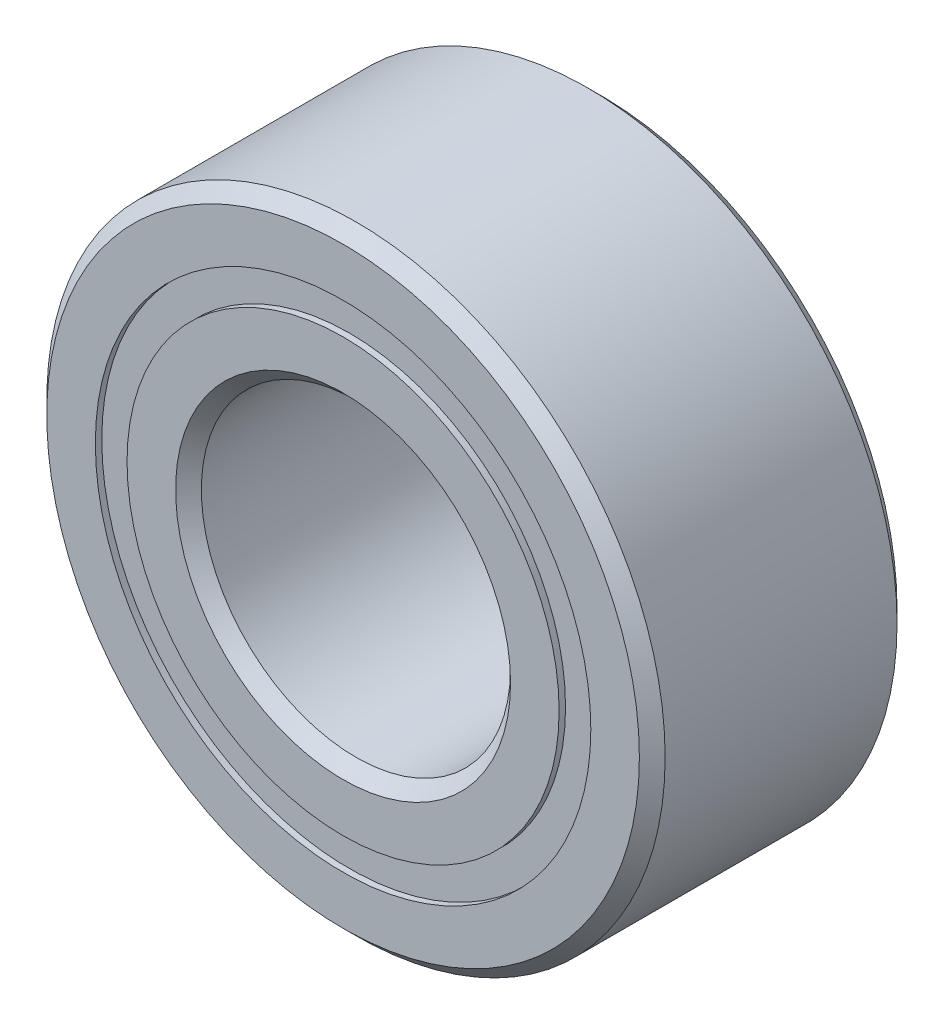
ISO-10303-21;
HEADER;
FILE_DESCRIPTION(('STEP AP214'),'2;1');
FILE_NAME('part.step','',(''),(''),'','','');
FILE_SCHEMA(('AUTOMOTIVE_DESIGN { 1 0 10303 214 1 1 1 1 }'));
ENDSEC;
DATA;
#1=APPLICATION_CONTEXT('core data for automotive mechanical design processes');
#2=APPLICATION_PROTOCOL_DEFINITION('international standard','automotive_design',2000,#1);
#3=PRODUCT_CONTEXT('',#1,'mechanical');
#4=PRODUCT('Part','Part','',(#3));
#5=PRODUCT_RELATED_PRODUCT_CATEGORY('part','',(#4));
#6=PRODUCT_DEFINITION_FORMATION('','',#4);
#7=PRODUCT_DEFINITION_CONTEXT('part definition',#1,'design');
#8=PRODUCT_DEFINITION('design','',#6,#7);
#9=PRODUCT_DEFINITION_SHAPE('','',#8);
#10=(LENGTH_UNIT() NAMED_UNIT(*) SI_UNIT(.MILLI.,.METRE.));
#11=(NAMED_UNIT(*) PLANE_ANGLE_UNIT() SI_UNIT($,.RADIAN.));
#12=(NAMED_UNIT(*) SI_UNIT($,.STERADIAN.) SOLID_ANGLE_UNIT());
#13=UNCERTAINTY_MEASURE_WITH_UNIT(LENGTH_MEASURE(1.E-05),#10,'distance_accuracy_value','');
#14=(GEOMETRIC_REPRESENTATION_CONTEXT(3) GLOBAL_UNCERTAINTY_ASSIGNED_CONTEXT((#13)) GLOBAL_UNIT_ASSIGNED_CONTEXT((#10,
#11,#12)) REPRESENTATION_CONTEXT('',''));
#15=CARTESIAN_POINT('',(0.,0.,0.));
#16=DIRECTION('',(0.,0.,1.));
#17=DIRECTION('',(1.,0.,0.));
#18=AXIS2_PLACEMENT_3D('',#15,#16,#17);
#19=CARTESIAN_POINT('',(0.,2.40384615384615,-1.1875));
#20=DIRECTION('',(0.,0.,1.));
#21=DIRECTION('',(1.,0.,0.));
#22=AXIS2_PLACEMENT_3D('',#19,#20,#21);
#23=PLANE('',#22);
#24=CARTESIAN_POINT('',(0.,0.,-1.1875));
#25=DIRECTION('',(0.,0.,1.));
#26=DIRECTION('',(1.,0.,0.));
#27=AXIS2_PLACEMENT_3D('',#24,#25,#26);
#28=CIRCLE('',#27,2.40384615384615);
#29=CARTESIAN_POINT('',(2.40384615384615,0.,-1.1875));
#30=VERTEX_POINT('',#29);
#31=EDGE_CURVE('E64',#30,#30,#28,.T.);
#32=ORIENTED_EDGE('',*,*,#31,.F.);
#33=EDGE_LOOP('',(#32));
#34=FACE_BOUND('',#33,.T.);
#35=CARTESIAN_POINT('',(0.,0.,-1.1875));
#36=DIRECTION('',(0.,0.,1.));
#37=DIRECTION('',(1.,0.,0.));
#38=AXIS2_PLACEMENT_3D('',#35,#36,#37);
#39=CIRCLE('',#38,2.09615384615385);
#40=CARTESIAN_POINT('',(2.09615384615385,0.,-1.1875));
#41=VERTEX_POINT('',#40);
#42=EDGE_CURVE('E11',#41,#41,#39,.T.);
#43=ORIENTED_EDGE('',*,*,#42,.T.);
#44=EDGE_LOOP('',(#43));
#45=FACE_BOUND('',#44,.T.);
#46=ADVANCED_FACE('F50',(#34,#45),#23,.F.);
#47=CARTESIAN_POINT('',(0.,0.,1.25));
#48=DIRECTION('',(0.,0.,1.));
#49=DIRECTION('',(1.,0.,0.));
#50=AXIS2_PLACEMENT_3D('',#47,#48,#49);
#51=CYLINDRICAL_SURFACE('',#50,2.09615384615385);
#52=ORIENTED_EDGE('',*,*,#42,.F.);
#53=EDGE_LOOP('',(#52));
#54=FACE_BOUND('',#53,.T.);
#55=CARTESIAN_POINT('',(0.,0.,-0.576463888168111));
#56=DIRECTION('',(0.,0.,1.));
#57=DIRECTION('',(1.,0.,0.));
#58=AXIS2_PLACEMENT_3D('',#55,#56,#57);
#59=CIRCLE('',#58,2.09615384615385);
#60=CARTESIAN_POINT('',(2.09615384615385,0.,-0.576463888168111));
#61=VERTEX_POINT('',#60);
#62=EDGE_CURVE('E56',#61,#61,#59,.T.);
#63=ORIENTED_EDGE('',*,*,#62,.T.);
#64=EDGE_LOOP('',(#63));
#65=FACE_BOUND('',#64,.T.);
#66=ADVANCED_FACE('F73',(#54,#65),#51,.F.);
#67=CARTESIAN_POINT('',(0.,2.40384615384615,-0.576463888168111));
#68=DIRECTION('',(0.,0.,-1.));
#69=DIRECTION('',(-1.,0.,0.));
#70=AXIS2_PLACEMENT_3D('',#67,#68,#69);
#71=PLANE('',#70);
#72=ORIENTED_EDGE('',*,*,#62,.F.);
#73=EDGE_LOOP('',(#72));
#74=FACE_BOUND('',#73,.T.);
#75=CARTESIAN_POINT('',(0.,0.,-0.576463888168111));
#76=DIRECTION('',(0.,0.,1.));
#77=DIRECTION('',(1.,0.,0.));
#78=AXIS2_PLACEMENT_3D('',#75,#76,#77);
#79=CIRCLE('',#78,2.40384615384615);
#80=CARTESIAN_POINT('',(2.40384615384615,0.,-0.576463888168111));
#81=VERTEX_POINT('',#80);
#82=EDGE_CURVE('E60',#81,#81,#79,.T.);
#83=ORIENTED_EDGE('',*,*,#82,.T.);
#84=EDGE_LOOP('',(#83));
#85=FACE_BOUND('',#84,.T.);
#86=ADVANCED_FACE('F77',(#74,#85),#71,.F.);
#87=CARTESIAN_POINT('',(0.,0.,1.25));
#88=DIRECTION('',(0.,0.,1.));
#89=DIRECTION('',(1.,0.,0.));
#90=AXIS2_PLACEMENT_3D('',#87,#88,#89);
#91=CYLINDRICAL_SURFACE('',#90,2.40384615384615);
#92=ORIENTED_EDGE('',*,*,#82,.F.);
#93=EDGE_LOOP('',(#92));
#94=FACE_BOUND('',#93,.T.);
#95=ORIENTED_EDGE('',*,*,#31,.T.);
#96=EDGE_LOOP('',(#95));
#97=FACE_BOUND('',#96,.T.);
#98=ADVANCED_FACE('F70',(#94,#97),#91,.T.);
#99=CLOSED_SHELL('',(#46,#66,#86,#98));
#100=MANIFOLD_SOLID_BREP('B2',#99);
#101=CARTESIAN_POINT('',(0.,2.40384615384615,1.1875));
#102=DIRECTION('',(0.,0.,-1.));
#103=DIRECTION('',(-1.,0.,0.));
#104=AXIS2_PLACEMENT_3D('',#101,#102,#103);
#105=PLANE('',#104);
#106=CARTESIAN_POINT('',(0.,0.,1.1875));
#107=DIRECTION('',(0.,0.,1.));
#108=DIRECTION('',(1.,0.,0.));
#109=AXIS2_PLACEMENT_3D('',#106,#107,#108);
#110=CIRCLE('',#109,2.09615384615385);
#111=CARTESIAN_POINT('',(2.09615384615385,0.,1.1875));
#112=VERTEX_POINT('',#111);
#113=EDGE_CURVE('E49',#112,#112,#110,.T.);
#114=ORIENTED_EDGE('',*,*,#113,.F.);
#115=EDGE_LOOP('',(#114));
#116=FACE_BOUND('',#115,.T.);
#117=CARTESIAN_POINT('',(0.,0.,1.1875));
#118=DIRECTION('',(0.,0.,1.));
#119=DIRECTION('',(1.,0.,0.));
#120=AXIS2_PLACEMENT_3D('',#117,#118,#119);
#121=CIRCLE('',#120,2.40384615384615);
#122=CARTESIAN_POINT('',(2.40384615384615,0.,1.1875));
#123=VERTEX_POINT('',#122);
#124=EDGE_CURVE('E124',#123,#123,#121,.T.);
#125=ORIENTED_EDGE('',*,*,#124,.T.);
#126=EDGE_LOOP('',(#125));
#127=FACE_BOUND('',#126,.T.);
#128=ADVANCED_FACE('F110',(#116,#127),#105,.F.);
#129=CARTESIAN_POINT('',(0.,0.,1.25));
#130=DIRECTION('',(0.,0.,1.));
#131=DIRECTION('',(1.,0.,0.));
#132=AXIS2_PLACEMENT_3D('',#129,#130,#131);
#133=CYLINDRICAL_SURFACE('',#132,2.09615384615385);
#134=CARTESIAN_POINT('',(0.,0.,0.576463888168111));
#135=DIRECTION('',(0.,0.,1.));
#136=DIRECTION('',(1.,0.,0.));
#137=AXIS2_PLACEMENT_3D('',#134,#135,#136);
#138=CIRCLE('',#137,2.09615384615385);
#139=CARTESIAN_POINT('',(2.09615384615385,0.,0.576463888168111));
#140=VERTEX_POINT('',#139);
#141=EDGE_CURVE('E116',#140,#140,#138,.T.);
#142=ORIENTED_EDGE('',*,*,#141,.F.);
#143=EDGE_LOOP('',(#142));
#144=FACE_BOUND('',#143,.T.);
#145=ORIENTED_EDGE('',*,*,#113,.T.);
#146=EDGE_LOOP('',(#145));
#147=FACE_BOUND('',#146,.T.);
#148=ADVANCED_FACE('F139',(#144,#147),#133,.F.);
#149=CARTESIAN_POINT('',(0.,2.40384615384615,0.576463888168111));
#150=DIRECTION('',(0.,0.,1.));
#151=DIRECTION('',(1.,0.,0.));
#152=AXIS2_PLACEMENT_3D('',#149,#150,#151);
#153=PLANE('',#152);
#154=CARTESIAN_POINT('',(0.,0.,0.576463888168111));
#155=DIRECTION('',(0.,0.,1.));
#156=DIRECTION('',(1.,0.,0.));
#157=AXIS2_PLACEMENT_3D('',#154,#155,#156);
#158=CIRCLE('',#157,2.40384615384615);
#159=CARTESIAN_POINT('',(2.40384615384615,0.,0.576463888168111));
#160=VERTEX_POINT('',#159);
#161=EDGE_CURVE('E120',#160,#160,#158,.T.);
#162=ORIENTED_EDGE('',*,*,#161,.F.);
#163=EDGE_LOOP('',(#162));
#164=FACE_BOUND('',#163,.T.);
#165=ORIENTED_EDGE('',*,*,#141,.T.);
#166=EDGE_LOOP('',(#165));
#167=FACE_BOUND('',#166,.T.);
#168=ADVANCED_FACE('F134',(#164,#167),#153,.F.);
#169=CARTESIAN_POINT('',(0.,0.,1.25));
#170=DIRECTION('',(0.,0.,1.));
#171=DIRECTION('',(1.,0.,0.));
#172=AXIS2_PLACEMENT_3D('',#169,#170,#171);
#173=CYLINDRICAL_SURFACE('',#172,2.40384615384615);
#174=ORIENTED_EDGE('',*,*,#124,.F.);
#175=EDGE_LOOP('',(#174));
#176=FACE_BOUND('',#175,.T.);
#177=ORIENTED_EDGE('',*,*,#161,.T.);
#178=EDGE_LOOP('',(#177));
#179=FACE_BOUND('',#178,.T.);
#180=ADVANCED_FACE('F131',(#176,#179),#173,.T.);
#181=CLOSED_SHELL('',(#128,#148,#168,#180));
#182=MANIFOLD_SOLID_BREP('B6',#181);
#183=CARTESIAN_POINT('',(-1.12499999999998,1.948557158515,0.));
#184=DIRECTION('',(0.,0.,1.));
#185=DIRECTION('',(-0.499999999999989,0.866025403784445,0.));
#186=AXIS2_PLACEMENT_3D('',#183,#184,#185);
#187=SPHERICAL_SURFACE('',#186,0.576463888168111);
#188=CARTESIAN_POINT('',(-1.12499999999998,1.948557158515,0.576463888168111));
#189=VERTEX_POINT('',#188);
#190=VERTEX_LOOP('',#189);
#191=FACE_BOUND('',#190,.T.);
#192=ADVANCED_FACE('F170',(#191),#187,.T.);
#193=CLOSED_SHELL('',(#192));
#194=MANIFOLD_SOLID_BREP('B44',#193);
#195=CARTESIAN_POINT('',(-1.94855715851497,1.12500000000002,0.));
#196=DIRECTION('',(0.,0.,1.));
#197=DIRECTION('',(-0.866025403784433,0.50000000000001,0.));
#198=AXIS2_PLACEMENT_3D('',#195,#196,#197);
#199=SPHERICAL_SURFACE('',#198,0.576463888168111);
#200=CARTESIAN_POINT('',(-1.94855715851497,1.12500000000002,0.576463888168111));
#201=VERTEX_POINT('',#200);
#202=VERTEX_LOOP('',#201);
#203=FACE_BOUND('',#202,.T.);
#204=ADVANCED_FACE('F193',(#203),#199,.T.);
#205=CLOSED_SHELL('',(#204));
#206=MANIFOLD_SOLID_BREP('B106',#205);
#207=CARTESIAN_POINT('',(-2.25,0.,0.));
#208=DIRECTION('',(0.,0.,1.));
#209=DIRECTION('',(-1.,0.,0.));
#210=AXIS2_PLACEMENT_3D('',#207,#208,#209);
#211=SPHERICAL_SURFACE('',#210,0.576463888168111);
#212=CARTESIAN_POINT('',(-2.25,0.,0.576463888168111));
#213=VERTEX_POINT('',#212);
#214=VERTEX_LOOP('',#213);
#215=FACE_BOUND('',#214,.T.);
#216=ADVANCED_FACE('F216',(#215),#211,.T.);
#217=CLOSED_SHELL('',(#216));
#218=MANIFOLD_SOLID_BREP('B166',#217);
#219=CARTESIAN_POINT('',(-1.948557158515,-1.12499999999998,0.));
#220=DIRECTION('',(0.,0.,1.));
#221=DIRECTION('',(-0.866025403784443,-0.499999999999992,0.));
#222=AXIS2_PLACEMENT_3D('',#219,#220,#221);
#223=SPHERICAL_SURFACE('',#222,0.576463888168111);
#224=CARTESIAN_POINT('',(-1.948557158515,-1.12499999999998,0.576463888168111));
#225=VERTEX_POINT('',#224);
#226=VERTEX_LOOP('',#225);
#227=FACE_BOUND('',#226,.T.);
#228=ADVANCED_FACE('F239',(#227),#223,.T.);
#229=CLOSED_SHELL('',(#228));
#230=MANIFOLD_SOLID_BREP('B189',#229);
#231=CARTESIAN_POINT('',(-1.12500000000002,-1.94855715851498,0.));
#232=DIRECTION('',(0.,0.,1.));
#233=DIRECTION('',(-0.500000000000007,-0.866025403784435,0.));
#234=AXIS2_PLACEMENT_3D('',#231,#232,#233);
#235=SPHERICAL_SURFACE('',#234,0.576463888168111);
#236=CARTESIAN_POINT('',(-1.12500000000002,-1.94855715851498,0.576463888168111));
#237=VERTEX_POINT('',#236);
#238=VERTEX_LOOP('',#237);
#239=FACE_BOUND('',#238,.T.);
#240=ADVANCED_FACE('F262',(#239),#235,.T.);
#241=CLOSED_SHELL('',(#240));
#242=MANIFOLD_SOLID_BREP('B212',#241);
#243=CARTESIAN_POINT('',(0.,-2.25,0.));
#244=DIRECTION('',(0.,0.,1.));
#245=DIRECTION('',(0.,-1.,0.));
#246=AXIS2_PLACEMENT_3D('',#243,#244,#245);
#247=SPHERICAL_SURFACE('',#246,0.576463888168111);
#248=CARTESIAN_POINT('',(0.,-2.25,0.576463888168111));
#249=VERTEX_POINT('',#248);
#250=VERTEX_LOOP('',#249);
#251=FACE_BOUND('',#250,.T.);
#252=ADVANCED_FACE('F285',(#251),#247,.T.);
#253=CLOSED_SHELL('',(#252));
#254=MANIFOLD_SOLID_BREP('B235',#253);
#255=CARTESIAN_POINT('',(1.12499999999999,-1.94855715851499,0.));
#256=DIRECTION('',(0.,0.,1.));
#257=DIRECTION('',(0.499999999999995,-0.866025403784442,0.));
#258=AXIS2_PLACEMENT_3D('',#255,#256,#257);
#259=SPHERICAL_SURFACE('',#258,0.576463888168111);
#260=CARTESIAN_POINT('',(1.12499999999999,-1.94855715851499,0.576463888168111));
#261=VERTEX_POINT('',#260);
#262=VERTEX_LOOP('',#261);
#263=FACE_BOUND('',#262,.T.);
#264=ADVANCED_FACE('F308',(#263),#259,.T.);
#265=CLOSED_SHELL('',(#264));
#266=MANIFOLD_SOLID_BREP('B258',#265);
#267=CARTESIAN_POINT('',(1.94855715851498,-1.12500000000001,0.));
#268=DIRECTION('',(0.,0.,1.));
#269=DIRECTION('',(0.866025403784436,-0.500000000000004,0.));
#270=AXIS2_PLACEMENT_3D('',#267,#268,#269);
#271=SPHERICAL_SURFACE('',#270,0.576463888168111);
#272=CARTESIAN_POINT('',(1.94855715851498,-1.12500000000001,0.576463888168111));
#273=VERTEX_POINT('',#272);
#274=VERTEX_LOOP('',#273);
#275=FACE_BOUND('',#274,.T.);
#276=ADVANCED_FACE('F331',(#275),#271,.T.);
#277=CLOSED_SHELL('',(#276));
#278=MANIFOLD_SOLID_BREP('B281',#277);
#279=CARTESIAN_POINT('',(2.25,0.,0.));
#280=DIRECTION('',(0.,0.,1.));
#281=DIRECTION('',(1.,0.,0.));
#282=AXIS2_PLACEMENT_3D('',#279,#280,#281);
#283=SPHERICAL_SURFACE('',#282,0.576463888168111);
#284=CARTESIAN_POINT('',(2.25,0.,0.576463888168111));
#285=VERTEX_POINT('',#284);
#286=VERTEX_LOOP('',#285);
#287=FACE_BOUND('',#286,.T.);
#288=ADVANCED_FACE('F354',(#287),#283,.T.);
#289=CLOSED_SHELL('',(#288));
#290=MANIFOLD_SOLID_BREP('B304',#289);
#291=CARTESIAN_POINT('',(1.94855715851499,1.125,0.));
#292=DIRECTION('',(0.,0.,1.));
#293=DIRECTION('',(0.86602540378444,0.499999999999998,0.));
#294=AXIS2_PLACEMENT_3D('',#291,#292,#293);
#295=SPHERICAL_SURFACE('',#294,0.576463888168111);
#296=CARTESIAN_POINT('',(1.94855715851499,1.125,0.576463888168111));
#297=VERTEX_POINT('',#296);
#298=VERTEX_LOOP('',#297);
#299=FACE_BOUND('',#298,.T.);
#300=ADVANCED_FACE('F377',(#299),#295,.T.);
#301=CLOSED_SHELL('',(#300));
#302=MANIFOLD_SOLID_BREP('B327',#301);
#303=CARTESIAN_POINT('',(1.125,1.94855715851499,0.));
#304=DIRECTION('',(0.,0.,1.));
#305=DIRECTION('',(0.500000000000001,0.866025403784438,0.));
#306=AXIS2_PLACEMENT_3D('',#303,#304,#305);
#307=SPHERICAL_SURFACE('',#306,0.576463888168111);
#308=CARTESIAN_POINT('',(1.125,1.94855715851499,0.576463888168111));
#309=VERTEX_POINT('',#308);
#310=VERTEX_LOOP('',#309);
#311=FACE_BOUND('',#310,.T.);
#312=ADVANCED_FACE('F400',(#311),#307,.T.);
#313=CLOSED_SHELL('',(#312));
#314=MANIFOLD_SOLID_BREP('B350',#313);
#315=CARTESIAN_POINT('',(0.,2.25,0.));
#316=DIRECTION('',(0.,0.,1.));
#317=DIRECTION('',(0.,1.,0.));
#318=AXIS2_PLACEMENT_3D('',#315,#316,#317);
#319=SPHERICAL_SURFACE('',#318,0.576463888168111);
#320=CARTESIAN_POINT('',(0.,2.25,0.576463888168111));
#321=VERTEX_POINT('',#320);
#322=VERTEX_LOOP('',#321);
#323=FACE_BOUND('',#322,.T.);
#324=ADVANCED_FACE('F425',(#323),#319,.T.);
#325=CLOSED_SHELL('',(#324));
#326=MANIFOLD_SOLID_BREP('B373',#325);
#327=CARTESIAN_POINT('',(0.,2.09615384615385,1.25));
#328=DIRECTION('',(0.,0.,-1.));
#329=DIRECTION('',(-1.,0.,0.));
#330=AXIS2_PLACEMENT_3D('',#327,#328,#329);
#331=PLANE('',#330);
#332=CARTESIAN_POINT('',(0.,0.,1.25));
#333=DIRECTION('',(0.,0.,1.));
#334=DIRECTION('',(1.,0.,0.));
#335=AXIS2_PLACEMENT_3D('',#332,#333,#334);
#336=CIRCLE('',#335,1.625);
#337=CARTESIAN_POINT('',(1.625,0.,1.25));
#338=VERTEX_POINT('',#337);
#339=EDGE_CURVE('E471',#338,#338,#336,.T.);
#340=ORIENTED_EDGE('',*,*,#339,.F.);
#341=EDGE_LOOP('',(#340));
#342=FACE_BOUND('',#341,.T.);
#343=CARTESIAN_POINT('',(0.,0.,1.25));
#344=DIRECTION('',(0.,0.,1.));
#345=DIRECTION('',(1.,0.,0.));
#346=AXIS2_PLACEMENT_3D('',#343,#344,#345);
#347=CIRCLE('',#346,2.09615384615385);
#348=CARTESIAN_POINT('',(2.09615384615385,0.,1.25));
#349=VERTEX_POINT('',#348);
#350=EDGE_CURVE('E424',#349,#349,#347,.T.);
#351=ORIENTED_EDGE('',*,*,#350,.T.);
#352=EDGE_LOOP('',(#351));
#353=FACE_BOUND('',#352,.T.);
#354=ADVANCED_FACE('F443',(#342,#353),#331,.F.);
#355=CARTESIAN_POINT('',(0.,0.,1.25));
#356=DIRECTION('',(0.,0.,1.));
#357=DIRECTION('',(1.,0.,0.));
#358=AXIS2_PLACEMENT_3D('',#355,#356,#357);
#359=CYLINDRICAL_SURFACE('',#358,2.09615384615385);
#360=ORIENTED_EDGE('',*,*,#350,.F.);
#361=EDGE_LOOP('',(#360));
#362=FACE_BOUND('',#361,.T.);
#363=CARTESIAN_POINT('',(0.,0.,0.555555555555555));
#364=DIRECTION('',(0.,0.,1.));
#365=DIRECTION('',(1.,0.,0.));
#366=AXIS2_PLACEMENT_3D('',#363,#364,#365);
#367=CIRCLE('',#366,2.09615384615385);
#368=CARTESIAN_POINT('',(2.09615384615385,0.,0.555555555555555));
#369=VERTEX_POINT('',#368);
#370=EDGE_CURVE('E449',#369,#369,#367,.T.);
#371=ORIENTED_EDGE('',*,*,#370,.T.);
#372=EDGE_LOOP('',(#371));
#373=FACE_BOUND('',#372,.T.);
#374=ADVANCED_FACE('F478',(#362,#373),#359,.T.);
#375=CARTESIAN_POINT('',(0.,0.,0.));
#376=DIRECTION('',(0.,0.,1.));
#377=DIRECTION('',(1.,0.,0.));
#378=AXIS2_PLACEMENT_3D('',#375,#376,#377);
#379=TOROIDAL_SURFACE('',#378,2.25,0.57646388816811);
#380=ORIENTED_EDGE('',*,*,#370,.F.);
#381=EDGE_LOOP('',(#380));
#382=FACE_BOUND('',#381,.T.);
#383=CARTESIAN_POINT('',(0.,0.,-0.555555555555556));
#384=DIRECTION('',(0.,0.,1.));
#385=DIRECTION('',(1.,0.,0.));
#386=AXIS2_PLACEMENT_3D('',#383,#384,#385);
#387=CIRCLE('',#386,2.09615384615385);
#388=CARTESIAN_POINT('',(2.09615384615385,0.,-0.555555555555556));
#389=VERTEX_POINT('',#388);
#390=EDGE_CURVE('E453',#389,#389,#387,.T.);
#391=ORIENTED_EDGE('',*,*,#390,.T.);
#392=EDGE_LOOP('',(#391));
#393=FACE_BOUND('',#392,.T.);
#394=ADVANCED_FACE('F482',(#382,#393),#379,.F.);
#395=CARTESIAN_POINT('',(0.,0.,1.25));
#396=DIRECTION('',(0.,0.,1.));
#397=DIRECTION('',(1.,0.,0.));
#398=AXIS2_PLACEMENT_3D('',#395,#396,#397);
#399=CYLINDRICAL_SURFACE('',#398,2.09615384615385);
#400=ORIENTED_EDGE('',*,*,#390,.F.);
#401=EDGE_LOOP('',(#400));
#402=FACE_BOUND('',#401,.T.);
#403=CARTESIAN_POINT('',(0.,0.,-1.25));
#404=DIRECTION('',(0.,0.,1.));
#405=DIRECTION('',(1.,0.,0.));
#406=AXIS2_PLACEMENT_3D('',#403,#404,#405);
#407=CIRCLE('',#406,2.09615384615385);
#408=CARTESIAN_POINT('',(2.09615384615385,0.,-1.25));
#409=VERTEX_POINT('',#408);
#410=EDGE_CURVE('E457',#409,#409,#407,.T.);
#411=ORIENTED_EDGE('',*,*,#410,.T.);
#412=EDGE_LOOP('',(#411));
#413=FACE_BOUND('',#412,.T.);
#414=ADVANCED_FACE('F487',(#402,#413),#399,.T.);
#415=CARTESIAN_POINT('',(0.,1.625,-1.25));
#416=DIRECTION('',(0.,0.,1.));
#417=DIRECTION('',(1.,0.,0.));
#418=AXIS2_PLACEMENT_3D('',#415,#416,#417);
#419=PLANE('',#418);
#420=ORIENTED_EDGE('',*,*,#410,.F.);
#421=EDGE_LOOP('',(#420));
#422=FACE_BOUND('',#421,.T.);
#423=CARTESIAN_POINT('',(0.,0.,-1.25));
#424=DIRECTION('',(0.,0.,1.));
#425=DIRECTION('',(1.,0.,0.));
#426=AXIS2_PLACEMENT_3D('',#423,#424,#425);
#427=CIRCLE('',#426,1.625);
#428=CARTESIAN_POINT('',(1.625,0.,-1.25));
#429=VERTEX_POINT('',#428);
#430=EDGE_CURVE('E462',#429,#429,#427,.T.);
#431=ORIENTED_EDGE('',*,*,#430,.T.);
#432=EDGE_LOOP('',(#431));
#433=FACE_BOUND('',#432,.T.);
#434=ADVANCED_FACE('F493',(#422,#433),#419,.F.);
#435=CARTESIAN_POINT('',(0.,0.,-1.125));
#436=DIRECTION('',(0.,0.,-1.));
#437=DIRECTION('',(-1.,0.,0.));
#438=AXIS2_PLACEMENT_3D('',#435,#436,#437);
#439=CONICAL_SURFACE('',#438,1.5,0.785398163397449);
#440=ORIENTED_EDGE('',*,*,#430,.F.);
#441=EDGE_LOOP('',(#440));
#442=FACE_BOUND('',#441,.T.);
#443=CARTESIAN_POINT('',(0.,0.,-1.125));
#444=DIRECTION('',(0.,0.,1.));
#445=DIRECTION('',(1.,0.,0.));
#446=AXIS2_PLACEMENT_3D('',#443,#444,#445);
#447=CIRCLE('',#446,1.5);
#448=CARTESIAN_POINT('',(1.5,0.,-1.125));
#449=VERTEX_POINT('',#448);
#450=EDGE_CURVE('E465',#449,#449,#447,.T.);
#451=ORIENTED_EDGE('',*,*,#450,.T.);
#452=EDGE_LOOP('',(#451));
#453=FACE_BOUND('',#452,.T.);
#454=ADVANCED_FACE('F497',(#442,#453),#439,.F.);
#455=CARTESIAN_POINT('',(0.,0.,1.25));
#456=DIRECTION('',(0.,0.,1.));
#457=DIRECTION('',(1.,0.,0.));
#458=AXIS2_PLACEMENT_3D('',#455,#456,#457);
#459=CYLINDRICAL_SURFACE('',#458,1.5);
#460=ORIENTED_EDGE('',*,*,#450,.F.);
#461=EDGE_LOOP('',(#460));
#462=FACE_BOUND('',#461,.T.);
#463=CARTESIAN_POINT('',(0.,0.,1.125));
#464=DIRECTION('',(0.,0.,1.));
#465=DIRECTION('',(1.,0.,0.));
#466=AXIS2_PLACEMENT_3D('',#463,#464,#465);
#467=CIRCLE('',#466,1.5);
#468=CARTESIAN_POINT('',(1.5,0.,1.125));
#469=VERTEX_POINT('',#468);
#470=EDGE_CURVE('E468',#469,#469,#467,.T.);
#471=ORIENTED_EDGE('',*,*,#470,.T.);
#472=EDGE_LOOP('',(#471));
#473=FACE_BOUND('',#472,.T.);
#474=ADVANCED_FACE('F501',(#462,#473),#459,.F.);
#475=CARTESIAN_POINT('',(0.,0.,1.25));
#476=DIRECTION('',(0.,0.,1.));
#477=DIRECTION('',(1.,0.,0.));
#478=AXIS2_PLACEMENT_3D('',#475,#476,#477);
#479=CONICAL_SURFACE('',#478,1.625,0.785398163397448);
#480=ORIENTED_EDGE('',*,*,#470,.F.);
#481=EDGE_LOOP('',(#480));
#482=FACE_BOUND('',#481,.T.);
#483=ORIENTED_EDGE('',*,*,#339,.T.);
#484=EDGE_LOOP('',(#483));
#485=FACE_BOUND('',#484,.T.);
#486=ADVANCED_FACE('F475',(#482,#485),#479,.F.);
#487=CLOSED_SHELL('',(#354,#374,#394,#414,#434,#454,#474,#486));
#488=MANIFOLD_SOLID_BREP('B396',#487);
#489=CARTESIAN_POINT('',(0.,0.,1.125));
#490=DIRECTION('',(0.,0.,-1.));
#491=DIRECTION('',(-1.,0.,0.));
#492=AXIS2_PLACEMENT_3D('',#489,#490,#491);
#493=CONICAL_SURFACE('',#492,3.,0.785398163397449);
#494=CARTESIAN_POINT('',(0.,0.,1.25));
#495=DIRECTION('',(0.,0.,1.));
#496=DIRECTION('',(1.,0.,0.));
#497=AXIS2_PLACEMENT_3D('',#494,#495,#496);
#498=CIRCLE('',#497,2.875);
#499=CARTESIAN_POINT('',(2.875,0.,1.25));
#500=VERTEX_POINT('',#499);
#501=EDGE_CURVE('E577',#500,#500,#498,.T.);
#502=ORIENTED_EDGE('',*,*,#501,.F.);
#503=EDGE_LOOP('',(#502));
#504=FACE_BOUND('',#503,.T.);
#505=CARTESIAN_POINT('',(0.,0.,1.125));
#506=DIRECTION('',(0.,0.,1.));
#507=DIRECTION('',(1.,0.,0.));
#508=AXIS2_PLACEMENT_3D('',#505,#506,#507);
#509=CIRCLE('',#508,3.);
#510=CARTESIAN_POINT('',(3.,0.,1.125));
#511=VERTEX_POINT('',#510);
#512=EDGE_CURVE('E442',#511,#511,#509,.T.);
#513=ORIENTED_EDGE('',*,*,#512,.T.);
#514=EDGE_LOOP('',(#513));
#515=FACE_BOUND('',#514,.T.);
#516=ADVANCED_FACE('F549',(#504,#515),#493,.T.);
#517=CARTESIAN_POINT('',(0.,0.,1.25));
#518=DIRECTION('',(0.,0.,1.));
#519=DIRECTION('',(1.,0.,0.));
#520=AXIS2_PLACEMENT_3D('',#517,#518,#519);
#521=CYLINDRICAL_SURFACE('',#520,3.);
#522=ORIENTED_EDGE('',*,*,#512,.F.);
#523=EDGE_LOOP('',(#522));
#524=FACE_BOUND('',#523,.T.);
#525=CARTESIAN_POINT('',(0.,0.,-1.125));
#526=DIRECTION('',(0.,0.,1.));
#527=DIRECTION('',(1.,0.,0.));
#528=AXIS2_PLACEMENT_3D('',#525,#526,#527);
#529=CIRCLE('',#528,3.);
#530=CARTESIAN_POINT('',(3.,0.,-1.125));
#531=VERTEX_POINT('',#530);
#532=EDGE_CURVE('E555',#531,#531,#529,.T.);
#533=ORIENTED_EDGE('',*,*,#532,.T.);
#534=EDGE_LOOP('',(#533));
#535=FACE_BOUND('',#534,.T.);
#536=ADVANCED_FACE('F584',(#524,#535),#521,.T.);
#537=CARTESIAN_POINT('',(0.,0.,-1.25));
#538=DIRECTION('',(0.,0.,1.));
#539=DIRECTION('',(1.,0.,0.));
#540=AXIS2_PLACEMENT_3D('',#537,#538,#539);
#541=CONICAL_SURFACE('',#540,2.875,0.78539816339745);
#542=ORIENTED_EDGE('',*,*,#532,.F.);
#543=EDGE_LOOP('',(#542));
#544=FACE_BOUND('',#543,.T.);
#545=CARTESIAN_POINT('',(0.,0.,-1.25));
#546=DIRECTION('',(0.,0.,1.));
#547=DIRECTION('',(1.,0.,0.));
#548=AXIS2_PLACEMENT_3D('',#545,#546,#547);
#549=CIRCLE('',#548,2.875);
#550=CARTESIAN_POINT('',(2.875,0.,-1.25));
#551=VERTEX_POINT('',#550);
#552=EDGE_CURVE('E559',#551,#551,#549,.T.);
#553=ORIENTED_EDGE('',*,*,#552,.T.);
#554=EDGE_LOOP('',(#553));
#555=FACE_BOUND('',#554,.T.);
#556=ADVANCED_FACE('F588',(#544,#555),#541,.T.);
#557=CARTESIAN_POINT('',(0.,2.875,-1.25));
#558=DIRECTION('',(0.,0.,1.));
#559=DIRECTION('',(1.,0.,0.));
#560=AXIS2_PLACEMENT_3D('',#557,#558,#559);
#561=PLANE('',#560);
#562=ORIENTED_EDGE('',*,*,#552,.F.);
#563=EDGE_LOOP('',(#562));
#564=FACE_BOUND('',#563,.T.);
#565=CARTESIAN_POINT('',(0.,0.,-1.25));
#566=DIRECTION('',(0.,0.,1.));
#567=DIRECTION('',(1.,0.,0.));
#568=AXIS2_PLACEMENT_3D('',#565,#566,#567);
#569=CIRCLE('',#568,2.40384615384615);
#570=CARTESIAN_POINT('',(2.40384615384615,0.,-1.25));
#571=VERTEX_POINT('',#570);
#572=EDGE_CURVE('E563',#571,#571,#569,.T.);
#573=ORIENTED_EDGE('',*,*,#572,.T.);
#574=EDGE_LOOP('',(#573));
#575=FACE_BOUND('',#574,.T.);
#576=ADVANCED_FACE('F593',(#564,#575),#561,.F.);
#577=CARTESIAN_POINT('',(0.,0.,1.25));
#578=DIRECTION('',(0.,0.,1.));
#579=DIRECTION('',(1.,0.,0.));
#580=AXIS2_PLACEMENT_3D('',#577,#578,#579);
#581=CYLINDRICAL_SURFACE('',#580,2.40384615384615);
#582=ORIENTED_EDGE('',*,*,#572,.F.);
#583=EDGE_LOOP('',(#582));
#584=FACE_BOUND('',#583,.T.);
#585=CARTESIAN_POINT('',(0.,0.,-0.555555555555556));
#586=DIRECTION('',(0.,0.,1.));
#587=DIRECTION('',(1.,0.,0.));
#588=AXIS2_PLACEMENT_3D('',#585,#586,#587);
#589=CIRCLE('',#588,2.40384615384615);
#590=CARTESIAN_POINT('',(2.40384615384615,0.,-0.555555555555556));
#591=VERTEX_POINT('',#590);
#592=EDGE_CURVE('E568',#591,#591,#589,.T.);
#593=ORIENTED_EDGE('',*,*,#592,.T.);
#594=EDGE_LOOP('',(#593));
#595=FACE_BOUND('',#594,.T.);
#596=ADVANCED_FACE('F599',(#584,#595),#581,.F.);
#597=CARTESIAN_POINT('',(0.,0.,0.));
#598=DIRECTION('',(0.,0.,1.));
#599=DIRECTION('',(1.,0.,0.));
#600=AXIS2_PLACEMENT_3D('',#597,#598,#599);
#601=TOROIDAL_SURFACE('',#600,2.25,0.576463888168111);
#602=ORIENTED_EDGE('',*,*,#592,.F.);
#603=EDGE_LOOP('',(#602));
#604=FACE_BOUND('',#603,.T.);
#605=CARTESIAN_POINT('',(0.,0.,0.555555555555555));
#606=DIRECTION('',(0.,0.,1.));
#607=DIRECTION('',(1.,0.,0.));
#608=AXIS2_PLACEMENT_3D('',#605,#606,#607);
#609=CIRCLE('',#608,2.40384615384615);
#610=CARTESIAN_POINT('',(2.40384615384615,0.,0.555555555555555));
#611=VERTEX_POINT('',#610);
#612=EDGE_CURVE('E571',#611,#611,#609,.T.);
#613=ORIENTED_EDGE('',*,*,#612,.T.);
#614=EDGE_LOOP('',(#613));
#615=FACE_BOUND('',#614,.T.);
#616=ADVANCED_FACE('F603',(#604,#615),#601,.F.);
#617=CARTESIAN_POINT('',(0.,0.,1.25));
#618=DIRECTION('',(0.,0.,1.));
#619=DIRECTION('',(1.,0.,0.));
#620=AXIS2_PLACEMENT_3D('',#617,#618,#619);
#621=CYLINDRICAL_SURFACE('',#620,2.40384615384615);
#622=ORIENTED_EDGE('',*,*,#612,.F.);
#623=EDGE_LOOP('',(#622));
#624=FACE_BOUND('',#623,.T.);
#625=CARTESIAN_POINT('',(0.,0.,1.25));
#626=DIRECTION('',(0.,0.,1.));
#627=DIRECTION('',(1.,0.,0.));
#628=AXIS2_PLACEMENT_3D('',#625,#626,#627);
#629=CIRCLE('',#628,2.40384615384615);
#630=CARTESIAN_POINT('',(2.40384615384615,0.,1.25));
#631=VERTEX_POINT('',#630);
#632=EDGE_CURVE('E574',#631,#631,#629,.T.);
#633=ORIENTED_EDGE('',*,*,#632,.T.);
#634=EDGE_LOOP('',(#633));
#635=FACE_BOUND('',#634,.T.);
#636=ADVANCED_FACE('F607',(#624,#635),#621,.F.);
#637=CARTESIAN_POINT('',(0.,2.875,1.25));
#638=DIRECTION('',(0.,0.,-1.));
#639=DIRECTION('',(-1.,0.,0.));
#640=AXIS2_PLACEMENT_3D('',#637,#638,#639);
#641=PLANE('',#640);
#642=ORIENTED_EDGE('',*,*,#632,.F.);
#643=EDGE_LOOP('',(#642));
#644=FACE_BOUND('',#643,.T.);
#645=ORIENTED_EDGE('',*,*,#501,.T.);
#646=EDGE_LOOP('',(#645));
#647=FACE_BOUND('',#646,.T.);
#648=ADVANCED_FACE('F581',(#644,#647),#641,.F.);
#649=CLOSED_SHELL('',(#516,#536,#556,#576,#596,#616,#636,#648));
#650=MANIFOLD_SOLID_BREP('B419',#649);
#651=ADVANCED_BREP_SHAPE_REPRESENTATION('',(#18,#100,#182,#194,#206,#218,#230,#242,#254,#266,
#278,#290,#302,#314,#326,#488,#650),#14);
#652=SHAPE_DEFINITION_REPRESENTATION(#9,#651);
ENDSEC;
END-ISO-10303-21;
